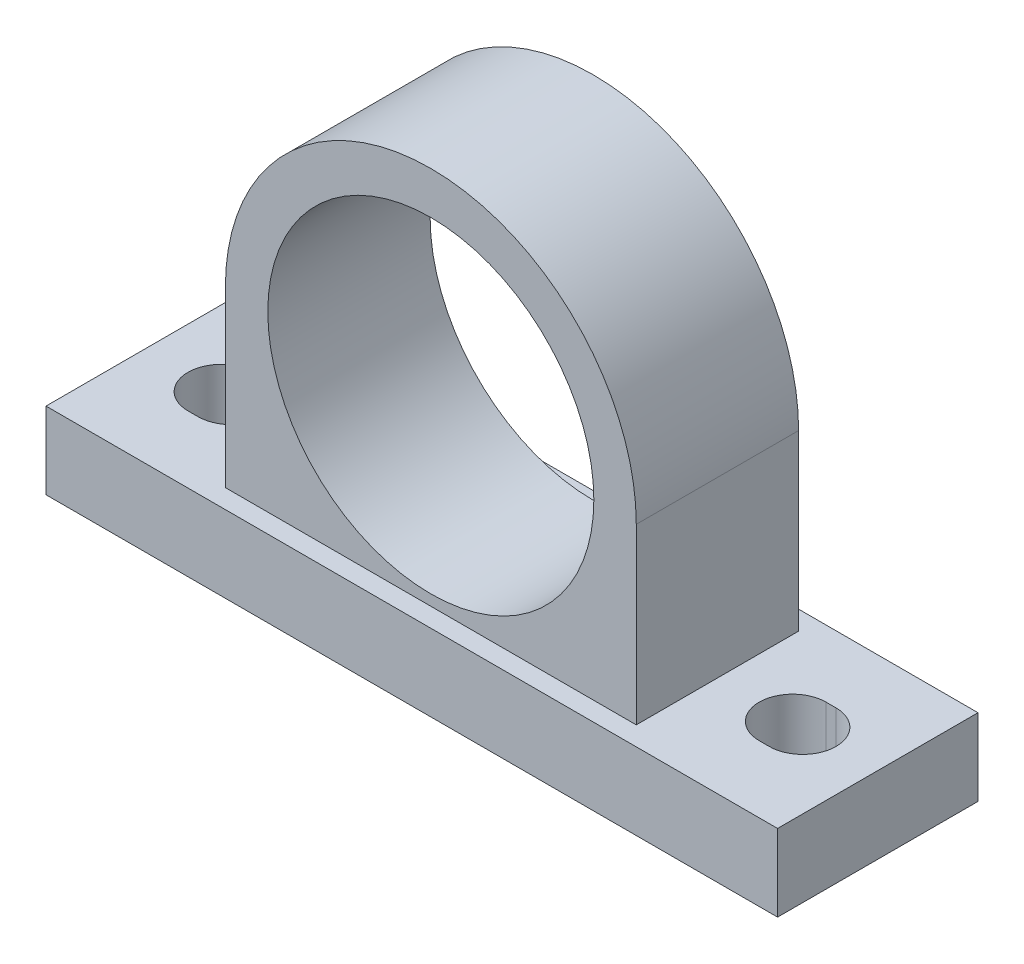
ISO-10303-21;
HEADER;
FILE_DESCRIPTION(('STEP AP214'),'2;1');
FILE_NAME('part.step','',(''),(''),'','','');
FILE_SCHEMA(('AUTOMOTIVE_DESIGN { 1 0 10303 214 1 1 1 1 }'));
ENDSEC;
DATA;
#1=APPLICATION_CONTEXT('core data for automotive mechanical design processes');
#2=APPLICATION_PROTOCOL_DEFINITION('international standard','automotive_design',2000,#1);
#3=PRODUCT_CONTEXT('',#1,'mechanical');
#4=PRODUCT('Part','Part','',(#3));
#5=PRODUCT_RELATED_PRODUCT_CATEGORY('part','',(#4));
#6=PRODUCT_DEFINITION_FORMATION('','',#4);
#7=PRODUCT_DEFINITION_CONTEXT('part definition',#1,'design');
#8=PRODUCT_DEFINITION('design','',#6,#7);
#9=PRODUCT_DEFINITION_SHAPE('','',#8);
#10=(LENGTH_UNIT() NAMED_UNIT(*) SI_UNIT(.MILLI.,.METRE.));
#11=(NAMED_UNIT(*) PLANE_ANGLE_UNIT() SI_UNIT($,.RADIAN.));
#12=(NAMED_UNIT(*) SI_UNIT($,.STERADIAN.) SOLID_ANGLE_UNIT());
#13=UNCERTAINTY_MEASURE_WITH_UNIT(LENGTH_MEASURE(1.E-05),#10,'distance_accuracy_value','');
#14=(GEOMETRIC_REPRESENTATION_CONTEXT(3) GLOBAL_UNCERTAINTY_ASSIGNED_CONTEXT((#13)) GLOBAL_UNIT_ASSIGNED_CONTEXT((#10,
#11,#12)) REPRESENTATION_CONTEXT('',''));
#15=CARTESIAN_POINT('',(0.,0.,0.));
#16=DIRECTION('',(0.,0.,1.));
#17=DIRECTION('',(1.,0.,0.));
#18=AXIS2_PLACEMENT_3D('',#15,#16,#17);
#19=CARTESIAN_POINT('',(0.,11.49985,0.));
#20=DIRECTION('',(0.,-1.,0.));
#21=DIRECTION('',(0.,0.,-1.));
#22=AXIS2_PLACEMENT_3D('',#19,#20,#21);
#23=PLANE('',#22);
#24=DIRECTION('',(0.,0.,-1.));
#25=VECTOR('',#24,1.);
#26=CARTESIAN_POINT('',(109.4994,11.49985,29.99994));
#27=LINE('',#26,#25);
#28=CARTESIAN_POINT('',(109.4994,11.49985,29.99994));
#29=VERTEX_POINT('',#28);
#30=CARTESIAN_POINT('',(109.4994,11.49985,-29.99994));
#31=VERTEX_POINT('',#30);
#32=EDGE_CURVE('E237',#29,#31,#27,.T.);
#33=ORIENTED_EDGE('',*,*,#32,.T.);
#34=DIRECTION('',(-1.,0.,0.));
#35=VECTOR('',#34,1.);
#36=CARTESIAN_POINT('',(-109.4994,11.49985,-29.99994));
#37=LINE('',#36,#35);
#38=CARTESIAN_POINT('',(-109.4994,11.49985,-29.99994));
#39=VERTEX_POINT('',#38);
#40=EDGE_CURVE('E240',#31,#39,#37,.T.);
#41=ORIENTED_EDGE('',*,*,#40,.T.);
#42=DIRECTION('',(0.,0.,1.));
#43=VECTOR('',#42,1.);
#44=CARTESIAN_POINT('',(-109.4994,11.49985,29.99994));
#45=LINE('',#44,#43);
#46=CARTESIAN_POINT('',(-109.4994,11.49985,29.99994));
#47=VERTEX_POINT('',#46);
#48=EDGE_CURVE('E243',#39,#47,#45,.T.);
#49=ORIENTED_EDGE('',*,*,#48,.T.);
#50=DIRECTION('',(1.,0.,0.));
#51=VECTOR('',#50,1.);
#52=CARTESIAN_POINT('',(-109.4994,11.49985,29.99994));
#53=LINE('',#52,#51);
#54=EDGE_CURVE('E245',#47,#29,#53,.T.);
#55=ORIENTED_EDGE('',*,*,#54,.T.);
#56=EDGE_LOOP('',(#33,#41,#49,#55));
#57=FACE_BOUND('',#56,.T.);
#58=DIRECTION('',(-1.,0.,0.));
#59=VECTOR('',#58,1.);
#60=CARTESIAN_POINT('',(87.0013499999999,11.49985,-9.99998000000061));
#61=LINE('',#60,#59);
#62=CARTESIAN_POINT('',(87.0013499999999,11.49985,-9.99998000000061));
#63=VERTEX_POINT('',#62);
#64=CARTESIAN_POINT('',(84.0016099999999,11.49985,-9.99998000000058));
#65=VERTEX_POINT('',#64);
#66=EDGE_CURVE('E169',#63,#65,#61,.T.);
#67=ORIENTED_EDGE('',*,*,#66,.F.);
#68=CARTESIAN_POINT('',(87.00135,11.49985,-6.07153216591882E-13));
#69=DIRECTION('',(0.,1.,0.));
#70=DIRECTION('',(0.,0.,-1.));
#71=AXIS2_PLACEMENT_3D('',#68,#69,#70);
#72=CIRCLE('',#71,9.99998);
#73=CARTESIAN_POINT('',(87.0013500000001,11.49985,9.99997999999939));
#74=VERTEX_POINT('',#73);
#75=EDGE_CURVE('E167',#74,#63,#72,.T.);
#76=ORIENTED_EDGE('',*,*,#75,.F.);
#77=DIRECTION('',(1.,0.,0.));
#78=VECTOR('',#77,1.);
#79=CARTESIAN_POINT('',(87.0013500000001,11.49985,9.99997999999939));
#80=LINE('',#79,#78);
#81=CARTESIAN_POINT('',(84.0016100000001,11.49985,9.99997999999942));
#82=VERTEX_POINT('',#81);
#83=EDGE_CURVE('E213',#82,#74,#80,.T.);
#84=ORIENTED_EDGE('',*,*,#83,.F.);
#85=CARTESIAN_POINT('',(84.00161,11.49985,-5.7921395987679E-13));
#86=DIRECTION('',(0.,1.,0.));
#87=DIRECTION('',(0.,0.,-1.));
#88=AXIS2_PLACEMENT_3D('',#85,#86,#87);
#89=CIRCLE('',#88,9.99998);
#90=EDGE_CURVE('E225',#65,#82,#89,.T.);
#91=ORIENTED_EDGE('',*,*,#90,.F.);
#92=EDGE_LOOP('',(#67,#76,#84,#91));
#93=FACE_BOUND('',#92,.T.);
#94=DIRECTION('',(1.,0.,0.));
#95=VECTOR('',#94,1.);
#96=CARTESIAN_POINT('',(-87.00135,11.49985,9.99998));
#97=LINE('',#96,#95);
#98=CARTESIAN_POINT('',(-87.00135,11.49985,9.99998));
#99=VERTEX_POINT('',#98);
#100=CARTESIAN_POINT('',(-84.00161,11.49985,9.99998));
#101=VERTEX_POINT('',#100);
#102=EDGE_CURVE('E191',#99,#101,#97,.T.);
#103=ORIENTED_EDGE('',*,*,#102,.F.);
#104=CARTESIAN_POINT('',(-87.00135,11.49985,0.));
#105=DIRECTION('',(0.,1.,0.));
#106=DIRECTION('',(0.,0.,1.));
#107=AXIS2_PLACEMENT_3D('',#104,#105,#106);
#108=CIRCLE('',#107,9.99998);
#109=CARTESIAN_POINT('',(-87.00135,11.49985,-9.99998));
#110=VERTEX_POINT('',#109);
#111=EDGE_CURVE('E189',#110,#99,#108,.T.);
#112=ORIENTED_EDGE('',*,*,#111,.F.);
#113=DIRECTION('',(-1.,0.,0.));
#114=VECTOR('',#113,1.);
#115=CARTESIAN_POINT('',(-87.00135,11.49985,-9.99998));
#116=LINE('',#115,#114);
#117=CARTESIAN_POINT('',(-84.00161,11.49985,-9.99998));
#118=VERTEX_POINT('',#117);
#119=EDGE_CURVE('E179',#118,#110,#116,.T.);
#120=ORIENTED_EDGE('',*,*,#119,.F.);
#121=CARTESIAN_POINT('',(-84.00161,11.49985,0.));
#122=DIRECTION('',(0.,1.,0.));
#123=DIRECTION('',(0.,0.,1.));
#124=AXIS2_PLACEMENT_3D('',#121,#122,#123);
#125=CIRCLE('',#124,9.99998);
#126=EDGE_CURVE('E195',#101,#118,#125,.T.);
#127=ORIENTED_EDGE('',*,*,#126,.F.);
#128=EDGE_LOOP('',(#103,#112,#120,#127));
#129=FACE_BOUND('',#128,.T.);
#130=DIRECTION('',(0.,0.,-1.));
#131=VECTOR('',#130,1.);
#132=CARTESIAN_POINT('',(-61.5010199999998,11.49985,24.30018));
#133=LINE('',#132,#131);
#134=CARTESIAN_POINT('',(-61.50102,11.49985,24.30018));
#135=VERTEX_POINT('',#134);
#136=CARTESIAN_POINT('',(-61.50102,11.49985,-24.30018));
#137=VERTEX_POINT('',#136);
#138=EDGE_CURVE('E54',#135,#137,#133,.T.);
#139=ORIENTED_EDGE('',*,*,#138,.T.);
#140=DIRECTION('',(1.,0.,0.));
#141=VECTOR('',#140,1.);
#142=CARTESIAN_POINT('',(-61.5010199999998,11.49985,-24.30018));
#143=LINE('',#142,#141);
#144=CARTESIAN_POINT('',(61.5010200000002,11.49985,-24.30018));
#145=VERTEX_POINT('',#144);
#146=EDGE_CURVE('E479',#137,#145,#143,.T.);
#147=ORIENTED_EDGE('',*,*,#146,.T.);
#148=DIRECTION('',(0.,0.,-1.));
#149=VECTOR('',#148,1.);
#150=CARTESIAN_POINT('',(61.5010200000002,11.49985,24.30018));
#151=LINE('',#150,#149);
#152=CARTESIAN_POINT('',(61.5010200000002,11.49985,24.30018));
#153=VERTEX_POINT('',#152);
#154=EDGE_CURVE('E171',#153,#145,#151,.T.);
#155=ORIENTED_EDGE('',*,*,#154,.F.);
#156=DIRECTION('',(1.,0.,0.));
#157=VECTOR('',#156,1.);
#158=CARTESIAN_POINT('',(-61.5010199999998,11.49985,24.30018));
#159=LINE('',#158,#157);
#160=EDGE_CURVE('E49',#135,#153,#159,.T.);
#161=ORIENTED_EDGE('',*,*,#160,.F.);
#162=EDGE_LOOP('',(#139,#147,#155,#161));
#163=FACE_BOUND('',#162,.T.);
#164=ADVANCED_FACE('F34',(#57,#93,#129,#163),#23,.F.);
#165=CARTESIAN_POINT('',(109.4994,11.49985,29.99994));
#166=DIRECTION('',(-1.,0.,0.));
#167=DIRECTION('',(0.,0.,1.));
#168=AXIS2_PLACEMENT_3D('',#165,#166,#167);
#169=PLANE('',#168);
#170=DIRECTION('',(0.,0.,-1.));
#171=VECTOR('',#170,1.);
#172=CARTESIAN_POINT('',(109.4994,-11.49985,29.99994));
#173=LINE('',#172,#171);
#174=CARTESIAN_POINT('',(109.4994,-11.49985,29.99994));
#175=VERTEX_POINT('',#174);
#176=CARTESIAN_POINT('',(109.4994,-11.49985,-29.99994));
#177=VERTEX_POINT('',#176);
#178=EDGE_CURVE('E202',#175,#177,#173,.T.);
#179=ORIENTED_EDGE('',*,*,#178,.T.);
#180=DIRECTION('',(0.,-1.,0.));
#181=VECTOR('',#180,1.);
#182=CARTESIAN_POINT('',(109.4994,11.49985,-29.99994));
#183=LINE('',#182,#181);
#184=EDGE_CURVE('E11',#31,#177,#183,.T.);
#185=ORIENTED_EDGE('',*,*,#184,.F.);
#186=ORIENTED_EDGE('',*,*,#32,.F.);
#187=DIRECTION('',(0.,-1.,0.));
#188=VECTOR('',#187,1.);
#189=CARTESIAN_POINT('',(109.4994,11.49985,29.99994));
#190=LINE('',#189,#188);
#191=EDGE_CURVE('E247',#29,#175,#190,.T.);
#192=ORIENTED_EDGE('',*,*,#191,.T.);
#193=EDGE_LOOP('',(#179,#185,#186,#192));
#194=FACE_BOUND('',#193,.T.);
#195=ADVANCED_FACE('F36',(#194),#169,.F.);
#196=CARTESIAN_POINT('',(-109.4994,11.49985,-29.99994));
#197=DIRECTION('',(0.,0.,1.));
#198=DIRECTION('',(1.,0.,0.));
#199=AXIS2_PLACEMENT_3D('',#196,#197,#198);
#200=PLANE('',#199);
#201=DIRECTION('',(-1.,0.,0.));
#202=VECTOR('',#201,1.);
#203=CARTESIAN_POINT('',(-109.4994,-11.49985,-29.99994));
#204=LINE('',#203,#202);
#205=CARTESIAN_POINT('',(-109.4994,-11.49985,-29.99994));
#206=VERTEX_POINT('',#205);
#207=EDGE_CURVE('E250',#177,#206,#204,.T.);
#208=ORIENTED_EDGE('',*,*,#207,.T.);
#209=DIRECTION('',(0.,-1.,0.));
#210=VECTOR('',#209,1.);
#211=CARTESIAN_POINT('',(-109.4994,11.49985,-29.99994));
#212=LINE('',#211,#210);
#213=EDGE_CURVE('E42',#39,#206,#212,.T.);
#214=ORIENTED_EDGE('',*,*,#213,.F.);
#215=ORIENTED_EDGE('',*,*,#40,.F.);
#216=ORIENTED_EDGE('',*,*,#184,.T.);
#217=EDGE_LOOP('',(#208,#214,#215,#216));
#218=FACE_BOUND('',#217,.T.);
#219=ADVANCED_FACE('F280',(#218),#200,.F.);
#220=CARTESIAN_POINT('',(-109.4994,11.49985,29.99994));
#221=DIRECTION('',(1.,0.,0.));
#222=DIRECTION('',(0.,0.,-1.));
#223=AXIS2_PLACEMENT_3D('',#220,#221,#222);
#224=PLANE('',#223);
#225=DIRECTION('',(0.,0.,1.));
#226=VECTOR('',#225,1.);
#227=CARTESIAN_POINT('',(-109.4994,-11.49985,29.99994));
#228=LINE('',#227,#226);
#229=CARTESIAN_POINT('',(-109.4994,-11.49985,29.99994));
#230=VERTEX_POINT('',#229);
#231=EDGE_CURVE('E252',#206,#230,#228,.T.);
#232=ORIENTED_EDGE('',*,*,#231,.T.);
#233=DIRECTION('',(0.,-1.,0.));
#234=VECTOR('',#233,1.);
#235=CARTESIAN_POINT('',(-109.4994,11.49985,29.99994));
#236=LINE('',#235,#234);
#237=EDGE_CURVE('E257',#47,#230,#236,.T.);
#238=ORIENTED_EDGE('',*,*,#237,.F.);
#239=ORIENTED_EDGE('',*,*,#48,.F.);
#240=ORIENTED_EDGE('',*,*,#213,.T.);
#241=EDGE_LOOP('',(#232,#238,#239,#240));
#242=FACE_BOUND('',#241,.T.);
#243=ADVANCED_FACE('F264',(#242),#224,.F.);
#244=CARTESIAN_POINT('',(-109.4994,11.49985,29.99994));
#245=DIRECTION('',(0.,0.,-1.));
#246=DIRECTION('',(-1.,0.,0.));
#247=AXIS2_PLACEMENT_3D('',#244,#245,#246);
#248=PLANE('',#247);
#249=DIRECTION('',(1.,0.,0.));
#250=VECTOR('',#249,1.);
#251=CARTESIAN_POINT('',(-109.4994,-11.49985,29.99994));
#252=LINE('',#251,#250);
#253=EDGE_CURVE('E241',#230,#175,#252,.T.);
#254=ORIENTED_EDGE('',*,*,#253,.T.);
#255=ORIENTED_EDGE('',*,*,#191,.F.);
#256=ORIENTED_EDGE('',*,*,#54,.F.);
#257=ORIENTED_EDGE('',*,*,#237,.T.);
#258=EDGE_LOOP('',(#254,#255,#256,#257));
#259=FACE_BOUND('',#258,.T.);
#260=ADVANCED_FACE('F273',(#259),#248,.F.);
#261=CARTESIAN_POINT('',(0.,-11.49985,0.));
#262=DIRECTION('',(0.,-1.,0.));
#263=DIRECTION('',(0.,0.,-1.));
#264=AXIS2_PLACEMENT_3D('',#261,#262,#263);
#265=PLANE('',#264);
#266=CARTESIAN_POINT('',(-87.00135,-11.49985,0.));
#267=DIRECTION('',(0.,1.,0.));
#268=DIRECTION('',(0.,0.,1.));
#269=AXIS2_PLACEMENT_3D('',#266,#267,#268);
#270=CIRCLE('',#269,9.99998);
#271=CARTESIAN_POINT('',(-87.00135,-11.49985,-9.99998));
#272=VERTEX_POINT('',#271);
#273=CARTESIAN_POINT('',(-87.00135,-11.49985,9.99998));
#274=VERTEX_POINT('',#273);
#275=EDGE_CURVE('E175',#272,#274,#270,.T.);
#276=ORIENTED_EDGE('',*,*,#275,.T.);
#277=DIRECTION('',(1.,0.,0.));
#278=VECTOR('',#277,1.);
#279=CARTESIAN_POINT('',(-87.00135,-11.49985,9.99998));
#280=LINE('',#279,#278);
#281=CARTESIAN_POINT('',(-84.00161,-11.49985,9.99998));
#282=VERTEX_POINT('',#281);
#283=EDGE_CURVE('E178',#274,#282,#280,.T.);
#284=ORIENTED_EDGE('',*,*,#283,.T.);
#285=CARTESIAN_POINT('',(-84.00161,-11.49985,0.));
#286=DIRECTION('',(0.,1.,0.));
#287=DIRECTION('',(0.,0.,1.));
#288=AXIS2_PLACEMENT_3D('',#285,#286,#287);
#289=CIRCLE('',#288,9.99998);
#290=CARTESIAN_POINT('',(-84.00161,-11.49985,-9.99998));
#291=VERTEX_POINT('',#290);
#292=EDGE_CURVE('E182',#282,#291,#289,.T.);
#293=ORIENTED_EDGE('',*,*,#292,.T.);
#294=DIRECTION('',(-1.,0.,0.));
#295=VECTOR('',#294,1.);
#296=CARTESIAN_POINT('',(-87.00135,-11.49985,-9.99998));
#297=LINE('',#296,#295);
#298=EDGE_CURVE('E185',#291,#272,#297,.T.);
#299=ORIENTED_EDGE('',*,*,#298,.T.);
#300=EDGE_LOOP('',(#276,#284,#293,#299));
#301=FACE_BOUND('',#300,.T.);
#302=CARTESIAN_POINT('',(87.00135,-11.49985,-6.07153216591882E-13));
#303=DIRECTION('',(0.,1.,0.));
#304=DIRECTION('',(0.,0.,-1.));
#305=AXIS2_PLACEMENT_3D('',#302,#303,#304);
#306=CIRCLE('',#305,9.99998);
#307=CARTESIAN_POINT('',(87.0013500000001,-11.49985,9.99997999999939));
#308=VERTEX_POINT('',#307);
#309=CARTESIAN_POINT('',(87.0013499999999,-11.49985,-9.99998000000061));
#310=VERTEX_POINT('',#309);
#311=EDGE_CURVE('E209',#308,#310,#306,.T.);
#312=ORIENTED_EDGE('',*,*,#311,.T.);
#313=DIRECTION('',(-1.,0.,0.));
#314=VECTOR('',#313,1.);
#315=CARTESIAN_POINT('',(87.0013499999999,-11.49985,-9.99998000000061));
#316=LINE('',#315,#314);
#317=CARTESIAN_POINT('',(84.0016099999999,-11.49985,-9.99998000000058));
#318=VERTEX_POINT('',#317);
#319=EDGE_CURVE('E212',#310,#318,#316,.T.);
#320=ORIENTED_EDGE('',*,*,#319,.T.);
#321=CARTESIAN_POINT('',(84.00161,-11.49985,-5.7921395987679E-13));
#322=DIRECTION('',(0.,1.,0.));
#323=DIRECTION('',(0.,0.,-1.));
#324=AXIS2_PLACEMENT_3D('',#321,#322,#323);
#325=CIRCLE('',#324,9.99998);
#326=CARTESIAN_POINT('',(84.0016100000001,-11.49985,9.99997999999942));
#327=VERTEX_POINT('',#326);
#328=EDGE_CURVE('E216',#318,#327,#325,.T.);
#329=ORIENTED_EDGE('',*,*,#328,.T.);
#330=DIRECTION('',(1.,0.,0.));
#331=VECTOR('',#330,1.);
#332=CARTESIAN_POINT('',(87.0013500000001,-11.49985,9.99997999999939));
#333=LINE('',#332,#331);
#334=EDGE_CURVE('E219',#327,#308,#333,.T.);
#335=ORIENTED_EDGE('',*,*,#334,.T.);
#336=EDGE_LOOP('',(#312,#320,#329,#335));
#337=FACE_BOUND('',#336,.T.);
#338=ORIENTED_EDGE('',*,*,#178,.F.);
#339=ORIENTED_EDGE('',*,*,#253,.F.);
#340=ORIENTED_EDGE('',*,*,#231,.F.);
#341=ORIENTED_EDGE('',*,*,#207,.F.);
#342=EDGE_LOOP('',(#338,#339,#340,#341));
#343=FACE_BOUND('',#342,.T.);
#344=ADVANCED_FACE('F270',(#301,#337,#343),#265,.T.);
#345=CARTESIAN_POINT('',(87.00135,-11.49985,-6.07153216591882E-13));
#346=DIRECTION('',(0.,1.,0.));
#347=DIRECTION('',(0.,0.,1.));
#348=AXIS2_PLACEMENT_3D('',#345,#346,#347);
#349=CYLINDRICAL_SURFACE('',#348,9.99998);
#350=ORIENTED_EDGE('',*,*,#75,.T.);
#351=DIRECTION('',(0.,1.,0.));
#352=VECTOR('',#351,1.);
#353=CARTESIAN_POINT('',(87.0013499999999,-11.49985,-9.99998000000061));
#354=LINE('',#353,#352);
#355=EDGE_CURVE('E221',#310,#63,#354,.T.);
#356=ORIENTED_EDGE('',*,*,#355,.F.);
#357=ORIENTED_EDGE('',*,*,#311,.F.);
#358=DIRECTION('',(0.,1.,0.));
#359=VECTOR('',#358,1.);
#360=CARTESIAN_POINT('',(87.0013500000001,-11.49985,9.99997999999939));
#361=LINE('',#360,#359);
#362=EDGE_CURVE('E192',#308,#74,#361,.T.);
#363=ORIENTED_EDGE('',*,*,#362,.T.);
#364=EDGE_LOOP('',(#350,#356,#357,#363));
#365=FACE_BOUND('',#364,.T.);
#366=ADVANCED_FACE('F293',(#365),#349,.F.);
#367=CARTESIAN_POINT('',(87.0013500000001,-11.49985,9.99997999999939));
#368=DIRECTION('',(0.,0.,1.));
#369=DIRECTION('',(1.,0.,0.));
#370=AXIS2_PLACEMENT_3D('',#367,#368,#369);
#371=PLANE('',#370);
#372=ORIENTED_EDGE('',*,*,#83,.T.);
#373=ORIENTED_EDGE('',*,*,#362,.F.);
#374=ORIENTED_EDGE('',*,*,#334,.F.);
#375=DIRECTION('',(0.,1.,0.));
#376=VECTOR('',#375,1.);
#377=CARTESIAN_POINT('',(84.0016100000001,-11.49985,9.99997999999942));
#378=LINE('',#377,#376);
#379=EDGE_CURVE('E231',#327,#82,#378,.T.);
#380=ORIENTED_EDGE('',*,*,#379,.T.);
#381=EDGE_LOOP('',(#372,#373,#374,#380));
#382=FACE_BOUND('',#381,.T.);
#383=ADVANCED_FACE('F313',(#382),#371,.F.);
#384=CARTESIAN_POINT('',(84.00161,-11.49985,-5.7921395987679E-13));
#385=DIRECTION('',(0.,1.,0.));
#386=DIRECTION('',(0.,0.,1.));
#387=AXIS2_PLACEMENT_3D('',#384,#385,#386);
#388=CYLINDRICAL_SURFACE('',#387,9.99998);
#389=ORIENTED_EDGE('',*,*,#90,.T.);
#390=ORIENTED_EDGE('',*,*,#379,.F.);
#391=ORIENTED_EDGE('',*,*,#328,.F.);
#392=DIRECTION('',(0.,1.,0.));
#393=VECTOR('',#392,1.);
#394=CARTESIAN_POINT('',(84.0016099999999,-11.49985,-9.99998000000058));
#395=LINE('',#394,#393);
#396=EDGE_CURVE('E233',#318,#65,#395,.T.);
#397=ORIENTED_EDGE('',*,*,#396,.T.);
#398=EDGE_LOOP('',(#389,#390,#391,#397));
#399=FACE_BOUND('',#398,.T.);
#400=ADVANCED_FACE('F320',(#399),#388,.F.);
#401=CARTESIAN_POINT('',(87.0013499999999,-11.49985,-9.99998000000061));
#402=DIRECTION('',(0.,0.,-1.));
#403=DIRECTION('',(-1.,0.,0.));
#404=AXIS2_PLACEMENT_3D('',#401,#402,#403);
#405=PLANE('',#404);
#406=ORIENTED_EDGE('',*,*,#66,.T.);
#407=ORIENTED_EDGE('',*,*,#396,.F.);
#408=ORIENTED_EDGE('',*,*,#319,.F.);
#409=ORIENTED_EDGE('',*,*,#355,.T.);
#410=EDGE_LOOP('',(#406,#407,#408,#409));
#411=FACE_BOUND('',#410,.T.);
#412=ADVANCED_FACE('F328',(#411),#405,.F.);
#413=CARTESIAN_POINT('',(-87.00135,-11.49985,0.));
#414=DIRECTION('',(0.,1.,0.));
#415=DIRECTION('',(0.,0.,1.));
#416=AXIS2_PLACEMENT_3D('',#413,#414,#415);
#417=CYLINDRICAL_SURFACE('',#416,9.99998);
#418=ORIENTED_EDGE('',*,*,#111,.T.);
#419=DIRECTION('',(0.,1.,0.));
#420=VECTOR('',#419,1.);
#421=CARTESIAN_POINT('',(-87.00135,-11.49985,9.99998));
#422=LINE('',#421,#420);
#423=EDGE_CURVE('E188',#274,#99,#422,.T.);
#424=ORIENTED_EDGE('',*,*,#423,.F.);
#425=ORIENTED_EDGE('',*,*,#275,.F.);
#426=DIRECTION('',(0.,1.,0.));
#427=VECTOR('',#426,1.);
#428=CARTESIAN_POINT('',(-87.00135,-11.49985,-9.99998));
#429=LINE('',#428,#427);
#430=EDGE_CURVE('E200',#272,#110,#429,.T.);
#431=ORIENTED_EDGE('',*,*,#430,.T.);
#432=EDGE_LOOP('',(#418,#424,#425,#431));
#433=FACE_BOUND('',#432,.T.);
#434=ADVANCED_FACE('F336',(#433),#417,.F.);
#435=CARTESIAN_POINT('',(-87.00135,-11.49985,-9.99998));
#436=DIRECTION('',(0.,0.,-1.));
#437=DIRECTION('',(-1.,0.,0.));
#438=AXIS2_PLACEMENT_3D('',#435,#436,#437);
#439=PLANE('',#438);
#440=ORIENTED_EDGE('',*,*,#119,.T.);
#441=ORIENTED_EDGE('',*,*,#430,.F.);
#442=ORIENTED_EDGE('',*,*,#298,.F.);
#443=DIRECTION('',(0.,1.,0.));
#444=VECTOR('',#443,1.);
#445=CARTESIAN_POINT('',(-84.00161,-11.49985,-9.99998));
#446=LINE('',#445,#444);
#447=EDGE_CURVE('E203',#291,#118,#446,.T.);
#448=ORIENTED_EDGE('',*,*,#447,.T.);
#449=EDGE_LOOP('',(#440,#441,#442,#448));
#450=FACE_BOUND('',#449,.T.);
#451=ADVANCED_FACE('F343',(#450),#439,.F.);
#452=CARTESIAN_POINT('',(-84.00161,-11.49985,0.));
#453=DIRECTION('',(0.,1.,0.));
#454=DIRECTION('',(0.,0.,1.));
#455=AXIS2_PLACEMENT_3D('',#452,#453,#454);
#456=CYLINDRICAL_SURFACE('',#455,9.99998);
#457=ORIENTED_EDGE('',*,*,#126,.T.);
#458=ORIENTED_EDGE('',*,*,#447,.F.);
#459=ORIENTED_EDGE('',*,*,#292,.F.);
#460=DIRECTION('',(0.,1.,0.));
#461=VECTOR('',#460,1.);
#462=CARTESIAN_POINT('',(-84.00161,-11.49985,9.99998));
#463=LINE('',#462,#461);
#464=EDGE_CURVE('E205',#282,#101,#463,.T.);
#465=ORIENTED_EDGE('',*,*,#464,.T.);
#466=EDGE_LOOP('',(#457,#458,#459,#465));
#467=FACE_BOUND('',#466,.T.);
#468=ADVANCED_FACE('F351',(#467),#456,.F.);
#469=CARTESIAN_POINT('',(-87.00135,-11.49985,9.99998));
#470=DIRECTION('',(0.,0.,1.));
#471=DIRECTION('',(1.,0.,0.));
#472=AXIS2_PLACEMENT_3D('',#469,#470,#471);
#473=PLANE('',#472);
#474=ORIENTED_EDGE('',*,*,#102,.T.);
#475=ORIENTED_EDGE('',*,*,#464,.F.);
#476=ORIENTED_EDGE('',*,*,#283,.F.);
#477=ORIENTED_EDGE('',*,*,#423,.T.);
#478=EDGE_LOOP('',(#474,#475,#476,#477));
#479=FACE_BOUND('',#478,.T.);
#480=ADVANCED_FACE('F359',(#479),#473,.F.);
#481=CARTESIAN_POINT('',(0.,63.5,24.30018));
#482=DIRECTION('',(0.,0.,1.));
#483=DIRECTION('',(1.,0.,0.));
#484=AXIS2_PLACEMENT_3D('',#481,#482,#483);
#485=PLANE('',#484);
#486=CARTESIAN_POINT('',(0.,63.5,24.30018));
#487=DIRECTION('',(0.,0.,1.));
#488=DIRECTION('',(1.,0.,0.));
#489=AXIS2_PLACEMENT_3D('',#486,#487,#488);
#490=CIRCLE('',#489,61.50102);
#491=CARTESIAN_POINT('',(61.50102,63.5,24.30018));
#492=VERTEX_POINT('',#491);
#493=CARTESIAN_POINT('',(-61.50102,63.5,24.30018));
#494=VERTEX_POINT('',#493);
#495=EDGE_CURVE('E152',#492,#494,#490,.T.);
#496=ORIENTED_EDGE('',*,*,#495,.T.);
#497=DIRECTION('',(0.,-1.,0.));
#498=VECTOR('',#497,1.);
#499=CARTESIAN_POINT('',(-61.50102,63.5,24.30018));
#500=LINE('',#499,#498);
#501=EDGE_CURVE('E145',#494,#135,#500,.T.);
#502=ORIENTED_EDGE('',*,*,#501,.T.);
#503=ORIENTED_EDGE('',*,*,#160,.T.);
#504=DIRECTION('',(0.,1.,0.));
#505=VECTOR('',#504,1.);
#506=CARTESIAN_POINT('',(61.50102,63.5,24.30018));
#507=LINE('',#506,#505);
#508=EDGE_CURVE('E158',#153,#492,#507,.T.);
#509=ORIENTED_EDGE('',*,*,#508,.T.);
#510=EDGE_LOOP('',(#496,#502,#503,#509));
#511=FACE_BOUND('',#510,.T.);
#512=CARTESIAN_POINT('',(0.,63.5,24.30018));
#513=DIRECTION('',(0.,0.,1.));
#514=DIRECTION('',(1.,0.,0.));
#515=AXIS2_PLACEMENT_3D('',#512,#513,#514);
#516=CIRCLE('',#515,48.80102);
#517=CARTESIAN_POINT('',(-48.80102,63.5,24.30018));
#518=VERTEX_POINT('',#517);
#519=EDGE_CURVE('E465',#518,#518,#516,.T.);
#520=ORIENTED_EDGE('',*,*,#519,.F.);
#521=EDGE_LOOP('',(#520));
#522=FACE_BOUND('',#521,.T.);
#523=ADVANCED_FACE('F155',(#511,#522),#485,.T.);
#524=CARTESIAN_POINT('',(0.,63.5,-24.30018));
#525=DIRECTION('',(0.,0.,1.));
#526=DIRECTION('',(1.,0.,0.));
#527=AXIS2_PLACEMENT_3D('',#524,#525,#526);
#528=PLANE('',#527);
#529=CARTESIAN_POINT('',(0.,63.5,-24.30018));
#530=DIRECTION('',(0.,0.,1.));
#531=DIRECTION('',(1.,0.,0.));
#532=AXIS2_PLACEMENT_3D('',#529,#530,#531);
#533=CIRCLE('',#532,61.50102);
#534=CARTESIAN_POINT('',(61.50102,63.5,-24.30018));
#535=VERTEX_POINT('',#534);
#536=CARTESIAN_POINT('',(-61.50102,63.5,-24.30018));
#537=VERTEX_POINT('',#536);
#538=EDGE_CURVE('E166',#535,#537,#533,.T.);
#539=ORIENTED_EDGE('',*,*,#538,.F.);
#540=DIRECTION('',(0.,1.,0.));
#541=VECTOR('',#540,1.);
#542=CARTESIAN_POINT('',(61.50102,63.5,-24.30018));
#543=LINE('',#542,#541);
#544=EDGE_CURVE('E162',#145,#535,#543,.T.);
#545=ORIENTED_EDGE('',*,*,#544,.F.);
#546=ORIENTED_EDGE('',*,*,#146,.F.);
#547=DIRECTION('',(0.,-1.,0.));
#548=VECTOR('',#547,1.);
#549=CARTESIAN_POINT('',(-61.50102,63.5,-24.30018));
#550=LINE('',#549,#548);
#551=EDGE_CURVE('E477',#537,#137,#550,.T.);
#552=ORIENTED_EDGE('',*,*,#551,.F.);
#553=EDGE_LOOP('',(#539,#545,#546,#552));
#554=FACE_BOUND('',#553,.T.);
#555=CARTESIAN_POINT('',(0.,63.5,-24.30018));
#556=DIRECTION('',(0.,0.,1.));
#557=DIRECTION('',(1.,0.,0.));
#558=AXIS2_PLACEMENT_3D('',#555,#556,#557);
#559=CIRCLE('',#558,48.80102);
#560=CARTESIAN_POINT('',(-48.80102,63.5,-24.30018));
#561=VERTEX_POINT('',#560);
#562=EDGE_CURVE('E468',#561,#561,#559,.T.);
#563=ORIENTED_EDGE('',*,*,#562,.T.);
#564=EDGE_LOOP('',(#563));
#565=FACE_BOUND('',#564,.T.);
#566=ADVANCED_FACE('F374',(#554,#565),#528,.F.);
#567=CARTESIAN_POINT('',(0.,63.5,24.30018));
#568=DIRECTION('',(0.,0.,-1.));
#569=DIRECTION('',(-1.,0.,0.));
#570=AXIS2_PLACEMENT_3D('',#567,#568,#569);
#571=CYLINDRICAL_SURFACE('',#570,61.50102);
#572=ORIENTED_EDGE('',*,*,#538,.T.);
#573=DIRECTION('',(0.,0.,-1.));
#574=VECTOR('',#573,1.);
#575=CARTESIAN_POINT('',(-61.50102,63.5,24.30018));
#576=LINE('',#575,#574);
#577=EDGE_CURVE('E149',#494,#537,#576,.T.);
#578=ORIENTED_EDGE('',*,*,#577,.F.);
#579=ORIENTED_EDGE('',*,*,#495,.F.);
#580=DIRECTION('',(0.,0.,-1.));
#581=VECTOR('',#580,1.);
#582=CARTESIAN_POINT('',(61.50102,63.5,24.30018));
#583=LINE('',#582,#581);
#584=EDGE_CURVE('E475',#492,#535,#583,.T.);
#585=ORIENTED_EDGE('',*,*,#584,.T.);
#586=EDGE_LOOP('',(#572,#578,#579,#585));
#587=FACE_BOUND('',#586,.T.);
#588=ADVANCED_FACE('F164',(#587),#571,.T.);
#589=CARTESIAN_POINT('',(-61.50102,63.5,24.30018));
#590=DIRECTION('',(1.,0.,0.));
#591=DIRECTION('',(0.,1.,0.));
#592=AXIS2_PLACEMENT_3D('',#589,#590,#591);
#593=PLANE('',#592);
#594=ORIENTED_EDGE('',*,*,#551,.T.);
#595=ORIENTED_EDGE('',*,*,#138,.F.);
#596=ORIENTED_EDGE('',*,*,#501,.F.);
#597=ORIENTED_EDGE('',*,*,#577,.T.);
#598=EDGE_LOOP('',(#594,#595,#596,#597));
#599=FACE_BOUND('',#598,.T.);
#600=ADVANCED_FACE('F147',(#599),#593,.F.);
#601=CARTESIAN_POINT('',(61.50102,63.5,24.30018));
#602=DIRECTION('',(-1.,0.,0.));
#603=DIRECTION('',(0.,-1.,0.));
#604=AXIS2_PLACEMENT_3D('',#601,#602,#603);
#605=PLANE('',#604);
#606=ORIENTED_EDGE('',*,*,#544,.T.);
#607=ORIENTED_EDGE('',*,*,#584,.F.);
#608=ORIENTED_EDGE('',*,*,#508,.F.);
#609=ORIENTED_EDGE('',*,*,#154,.T.);
#610=EDGE_LOOP('',(#606,#607,#608,#609));
#611=FACE_BOUND('',#610,.T.);
#612=ADVANCED_FACE('F394',(#611),#605,.F.);
#613=CARTESIAN_POINT('',(0.,63.5,24.30018));
#614=DIRECTION('',(0.,0.,-1.));
#615=DIRECTION('',(-1.,0.,0.));
#616=AXIS2_PLACEMENT_3D('',#613,#614,#615);
#617=CYLINDRICAL_SURFACE('',#616,48.80102);
#618=CARTESIAN_POINT('',(-48.80102,63.5,24.30018));
#619=CARTESIAN_POINT('',(-48.80102,63.5,23.79392625));
#620=CARTESIAN_POINT('',(-48.80102,63.5,23.2876725));
#621=CARTESIAN_POINT('',(-48.80102,63.5,22.275165));
#622=CARTESIAN_POINT('',(-48.80102,63.5,21.76891125));
#623=CARTESIAN_POINT('',(-48.80102,63.5,20.75640375));
#624=CARTESIAN_POINT('',(-48.80102,63.5,20.25015));
#625=CARTESIAN_POINT('',(-48.80102,63.5,19.2376425));
#626=CARTESIAN_POINT('',(-48.80102,63.5,18.73138875));
#627=CARTESIAN_POINT('',(-48.80102,63.5,17.71888125));
#628=CARTESIAN_POINT('',(-48.80102,63.5,17.2126275));
#629=CARTESIAN_POINT('',(-48.80102,63.5,16.20012));
#630=CARTESIAN_POINT('',(-48.80102,63.5,15.69386625));
#631=CARTESIAN_POINT('',(-48.80102,63.5,14.68135875));
#632=CARTESIAN_POINT('',(-48.80102,63.5,14.175105));
#633=CARTESIAN_POINT('',(-48.80102,63.5,13.1625975));
#634=CARTESIAN_POINT('',(-48.80102,63.5,12.65634375));
#635=CARTESIAN_POINT('',(-48.80102,63.5,11.64383625));
#636=CARTESIAN_POINT('',(-48.80102,63.5,11.1375825));
#637=CARTESIAN_POINT('',(-48.80102,63.5,10.125075));
#638=CARTESIAN_POINT('',(-48.80102,63.5,9.61882124999999));
#639=CARTESIAN_POINT('',(-48.80102,63.5,8.60631374999999));
#640=CARTESIAN_POINT('',(-48.80102,63.5,8.10005999999999));
#641=CARTESIAN_POINT('',(-48.80102,63.5,7.08755249999999));
#642=CARTESIAN_POINT('',(-48.80102,63.5,6.58129874999999));
#643=CARTESIAN_POINT('',(-48.80102,63.5,5.56879124999999));
#644=CARTESIAN_POINT('',(-48.80102,63.5,5.06253749999999));
#645=CARTESIAN_POINT('',(-48.80102,63.5,4.05002999999999));
#646=CARTESIAN_POINT('',(-48.80102,63.5,3.54377624999999));
#647=CARTESIAN_POINT('',(-48.80102,63.5,2.53126874999999));
#648=CARTESIAN_POINT('',(-48.80102,63.5,2.02501499999999));
#649=CARTESIAN_POINT('',(-48.80102,63.5,1.01250749999999));
#650=CARTESIAN_POINT('',(-48.80102,63.5,0.506253749999993));
#651=CARTESIAN_POINT('',(-48.80102,63.5,-0.506253750000007));
#652=CARTESIAN_POINT('',(-48.80102,63.5,-1.01250750000001));
#653=CARTESIAN_POINT('',(-48.80102,63.5,-2.02501500000001));
#654=CARTESIAN_POINT('',(-48.80102,63.5,-2.53126875000001));
#655=CARTESIAN_POINT('',(-48.80102,63.5,-3.54377625000001));
#656=CARTESIAN_POINT('',(-48.80102,63.5,-4.05003000000001));
#657=CARTESIAN_POINT('',(-48.80102,63.5,-5.06253750000001));
#658=CARTESIAN_POINT('',(-48.80102,63.5,-5.56879125000001));
#659=CARTESIAN_POINT('',(-48.80102,63.5,-6.58129875000001));
#660=CARTESIAN_POINT('',(-48.80102,63.5,-7.0875525));
#661=CARTESIAN_POINT('',(-48.80102,63.5,-8.10006));
#662=CARTESIAN_POINT('',(-48.80102,63.5,-8.60631375));
#663=CARTESIAN_POINT('',(-48.80102,63.5,-9.61882125));
#664=CARTESIAN_POINT('',(-48.80102,63.5,-10.125075));
#665=CARTESIAN_POINT('',(-48.80102,63.5,-11.1375825));
#666=CARTESIAN_POINT('',(-48.80102,63.5,-11.64383625));
#667=CARTESIAN_POINT('',(-48.80102,63.5,-12.65634375));
#668=CARTESIAN_POINT('',(-48.80102,63.5,-13.1625975));
#669=CARTESIAN_POINT('',(-48.80102,63.5,-14.175105));
#670=CARTESIAN_POINT('',(-48.80102,63.5,-14.68135875));
#671=CARTESIAN_POINT('',(-48.80102,63.5,-15.69386625));
#672=CARTESIAN_POINT('',(-48.80102,63.5,-16.20012));
#673=CARTESIAN_POINT('',(-48.80102,63.5,-17.2126275));
#674=CARTESIAN_POINT('',(-48.80102,63.5,-17.71888125));
#675=CARTESIAN_POINT('',(-48.80102,63.5,-18.73138875));
#676=CARTESIAN_POINT('',(-48.80102,63.5,-19.2376425));
#677=CARTESIAN_POINT('',(-48.80102,63.5,-20.25015));
#678=CARTESIAN_POINT('',(-48.80102,63.5,-20.75640375));
#679=CARTESIAN_POINT('',(-48.80102,63.5,-21.76891125));
#680=CARTESIAN_POINT('',(-48.80102,63.5,-22.275165));
#681=CARTESIAN_POINT('',(-48.80102,63.5,-23.2876725));
#682=CARTESIAN_POINT('',(-48.80102,63.5,-23.79392625));
#683=CARTESIAN_POINT('',(-48.80102,63.5,-24.30018));
#684=B_SPLINE_CURVE_WITH_KNOTS('',3,(#618,#619,#620,#621,#622,#623,#624,#625,#626,#627,#628,
#629,#630,#631,#632,#633,#634,#635,#636,#637,#638,#639,#640,#641,#642,#643,#644,#645,#646,#647,
#648,#649,#650,#651,#652,#653,#654,#655,#656,#657,#658,#659,#660,#661,#662,#663,#664,#665,#666,
#667,#668,#669,#670,#671,#672,#673,#674,#675,#676,#677,#678,#679,#680,#681,#682,#683),
.UNSPECIFIED.,.F.,.F.,(4,2,2,2,2,2,2,2,2,2,2,2,2,2,2,2,2,2,2,2,2,2,2,2,2,2,2,2,2,2,2,2,4),(0.,
1.51876125,3.0375225,4.55628375,6.075045,7.59380625,9.1125675,10.63132875,12.15009,13.66885125,
15.1876125,16.70637375,18.225135,19.74389625,21.2626575,22.78141875,24.30018,25.81894125,
27.3377025,28.85646375,30.375225,31.89398625,33.4127475,34.93150875,36.45027,37.96903125,
39.4877925,41.00655375,42.525315,44.04407625,45.5628375,47.08159875,48.60036),.UNSPECIFIED.);
#685=EDGE_CURVE('BSEAM401',#518,#561,#684,.T.);
#686=ORIENTED_EDGE('',*,*,#519,.T.);
#687=ORIENTED_EDGE('',*,*,#562,.F.);
#688=ORIENTED_EDGE('',*,*,#685,.T.);
#689=ORIENTED_EDGE('',*,*,#685,.F.);
#690=EDGE_LOOP('',(#686,#688,#687,#689));
#691=FACE_BOUND('',#690,.T.);
#692=ADVANCED_FACE('F401',(#691),#617,.F.);
#693=CLOSED_SHELL('',(#164,#195,#219,#243,#260,#344,#366,#383,#400,#412,#434,#451,#468,#480,
#523,#566,#588,#600,#612,#692));
#694=MANIFOLD_SOLID_BREP('B2',#693);
#695=ADVANCED_BREP_SHAPE_REPRESENTATION('',(#18,#694),#14);
#696=SHAPE_DEFINITION_REPRESENTATION(#9,#695);
ENDSEC;
END-ISO-10303-21;
